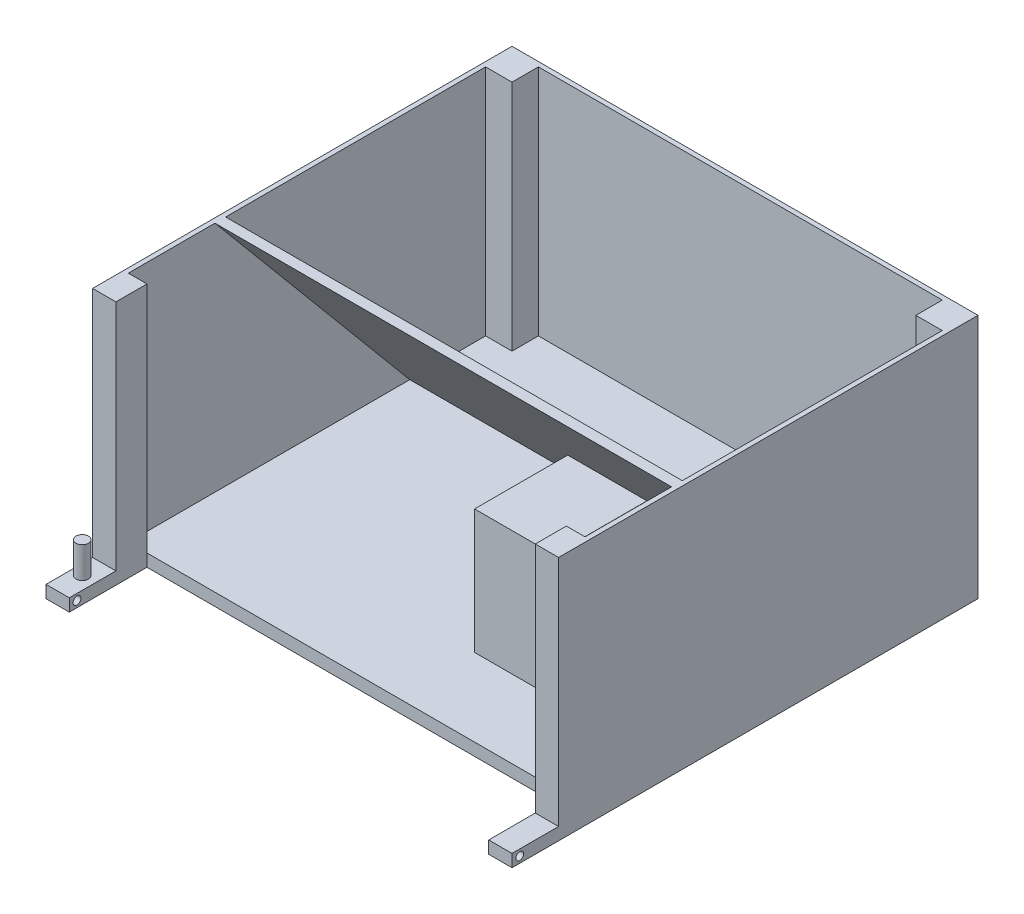
ISO-10303-21;
HEADER;
FILE_DESCRIPTION(('STEP AP214'),'2;1');
FILE_NAME('part.step','',(''),(''),'','','');
FILE_SCHEMA(('AUTOMOTIVE_DESIGN { 1 0 10303 214 1 1 1 1 }'));
ENDSEC;
DATA;
#1=APPLICATION_CONTEXT('core data for automotive mechanical design processes');
#2=APPLICATION_PROTOCOL_DEFINITION('international standard','automotive_design',2000,#1);
#3=PRODUCT_CONTEXT('',#1,'mechanical');
#4=PRODUCT('Part','Part','',(#3));
#5=PRODUCT_RELATED_PRODUCT_CATEGORY('part','',(#4));
#6=PRODUCT_DEFINITION_FORMATION('','',#4);
#7=PRODUCT_DEFINITION_CONTEXT('part definition',#1,'design');
#8=PRODUCT_DEFINITION('design','',#6,#7);
#9=PRODUCT_DEFINITION_SHAPE('','',#8);
#10=(LENGTH_UNIT() NAMED_UNIT(*) SI_UNIT(.MILLI.,.METRE.));
#11=(NAMED_UNIT(*) PLANE_ANGLE_UNIT() SI_UNIT($,.RADIAN.));
#12=(NAMED_UNIT(*) SI_UNIT($,.STERADIAN.) SOLID_ANGLE_UNIT());
#13=UNCERTAINTY_MEASURE_WITH_UNIT(LENGTH_MEASURE(1.E-05),#10,'distance_accuracy_value','');
#14=(GEOMETRIC_REPRESENTATION_CONTEXT(3) GLOBAL_UNCERTAINTY_ASSIGNED_CONTEXT((#13)) GLOBAL_UNIT_ASSIGNED_CONTEXT((#10,
#11,#12)) REPRESENTATION_CONTEXT('',''));
#15=CARTESIAN_POINT('',(0.,0.,0.));
#16=DIRECTION('',(0.,0.,1.));
#17=DIRECTION('',(1.,0.,0.));
#18=AXIS2_PLACEMENT_3D('',#15,#16,#17);
#19=CARTESIAN_POINT('',(0.,8.,0.));
#20=DIRECTION('',(0.,1.,0.));
#21=DIRECTION('',(0.,0.,1.));
#22=AXIS2_PLACEMENT_3D('',#19,#20,#21);
#23=PLANE('',#22);
#24=DIRECTION('',(1.,0.,0.));
#25=VECTOR('',#24,1.);
#26=CARTESIAN_POINT('',(0.,8.,-81.2002498096229));
#27=LINE('',#26,#25);
#28=CARTESIAN_POINT('',(-147.,8.,-81.2002498096229));
#29=VERTEX_POINT('',#28);
#30=CARTESIAN_POINT('',(147.,7.99999999999999,-81.2002498096229));
#31=VERTEX_POINT('',#30);
#32=EDGE_CURVE('E240',#29,#31,#27,.T.);
#33=ORIENTED_EDGE('',*,*,#32,.F.);
#34=DIRECTION('',(0.,0.,-1.));
#35=VECTOR('',#34,1.);
#36=CARTESIAN_POINT('',(-147.,8.,-147.));
#37=LINE('',#36,#35);
#38=CARTESIAN_POINT('',(-147.,8.,100.));
#39=VERTEX_POINT('',#38);
#40=EDGE_CURVE('E273',#39,#29,#37,.T.);
#41=ORIENTED_EDGE('',*,*,#40,.F.);
#42=DIRECTION('',(-1.,0.,0.));
#43=VECTOR('',#42,1.);
#44=CARTESIAN_POINT('',(-150.,8.,100.));
#45=LINE('',#44,#43);
#46=CARTESIAN_POINT('',(-135.,8.,100.));
#47=VERTEX_POINT('',#46);
#48=EDGE_CURVE('E295',#47,#39,#45,.T.);
#49=ORIENTED_EDGE('',*,*,#48,.F.);
#50=DIRECTION('',(1.,0.,0.));
#51=VECTOR('',#50,1.);
#52=CARTESIAN_POINT('',(-135.,8.,100.));
#53=LINE('',#52,#51);
#54=CARTESIAN_POINT('',(135.,8.,100.));
#55=VERTEX_POINT('',#54);
#56=EDGE_CURVE('E386',#47,#55,#53,.T.);
#57=ORIENTED_EDGE('',*,*,#56,.T.);
#58=DIRECTION('',(-1.,0.,0.));
#59=VECTOR('',#58,1.);
#60=CARTESIAN_POINT('',(150.,8.,100.));
#61=LINE('',#60,#59);
#62=CARTESIAN_POINT('',(147.,8.,100.));
#63=VERTEX_POINT('',#62);
#64=EDGE_CURVE('E313',#63,#55,#61,.T.);
#65=ORIENTED_EDGE('',*,*,#64,.F.);
#66=DIRECTION('',(0.,0.,1.));
#67=VECTOR('',#66,1.);
#68=CARTESIAN_POINT('',(147.,8.,-147.));
#69=LINE('',#68,#67);
#70=EDGE_CURVE('E263',#31,#63,#69,.T.);
#71=ORIENTED_EDGE('',*,*,#70,.F.);
#72=EDGE_LOOP('',(#33,#41,#49,#57,#65,#71));
#73=FACE_BOUND('',#72,.T.);
#74=DIRECTION('',(1.,0.,0.));
#75=VECTOR('',#74,1.);
#76=CARTESIAN_POINT('',(25.8889273202823,8.,50.));
#77=LINE('',#76,#75);
#78=CARTESIAN_POINT('',(25.8889273202823,8.,50.));
#79=VERTEX_POINT('',#78);
#80=CARTESIAN_POINT('',(76.8889273202823,8.,50.));
#81=VERTEX_POINT('',#80);
#82=EDGE_CURVE('E467',#79,#81,#77,.T.);
#83=ORIENTED_EDGE('',*,*,#82,.F.);
#84=DIRECTION('',(0.,0.,1.));
#85=VECTOR('',#84,1.);
#86=CARTESIAN_POINT('',(25.8889273202823,8.,-9.99999999999998));
#87=LINE('',#86,#85);
#88=CARTESIAN_POINT('',(25.8889273202823,8.,-9.99999999999998));
#89=VERTEX_POINT('',#88);
#90=EDGE_CURVE('E453',#89,#79,#87,.T.);
#91=ORIENTED_EDGE('',*,*,#90,.F.);
#92=DIRECTION('',(-1.,0.,0.));
#93=VECTOR('',#92,1.);
#94=CARTESIAN_POINT('',(25.8889273202823,8.,-9.99999999999998));
#95=LINE('',#94,#93);
#96=CARTESIAN_POINT('',(76.8889273202823,8.,-9.99999999999998));
#97=VERTEX_POINT('',#96);
#98=EDGE_CURVE('E458',#97,#89,#95,.T.);
#99=ORIENTED_EDGE('',*,*,#98,.F.);
#100=DIRECTION('',(0.,0.,-1.));
#101=VECTOR('',#100,1.);
#102=CARTESIAN_POINT('',(76.8889273202823,8.,-9.99999999999998));
#103=LINE('',#102,#101);
#104=EDGE_CURVE('E469',#81,#97,#103,.T.);
#105=ORIENTED_EDGE('',*,*,#104,.F.);
#106=EDGE_LOOP('',(#83,#91,#99,#105));
#107=FACE_BOUND('',#106,.T.);
#108=ADVANCED_FACE('F43',(#73,#107),#23,.T.);
#109=CARTESIAN_POINT('',(-147.,158.,-147.));
#110=DIRECTION('',(-1.,0.,0.));
#111=DIRECTION('',(0.,0.,1.));
#112=AXIS2_PLACEMENT_3D('',#109,#110,#111);
#113=PLANE('',#112);
#114=ORIENTED_EDGE('',*,*,#40,.T.);
#115=DIRECTION('',(0.,0.767076250368895,0.641555941535886));
#116=VECTOR('',#115,1.);
#117=CARTESIAN_POINT('',(-147.,63.8793699657748,-34.4646850028852));
#118=LINE('',#117,#116);
#119=CARTESIAN_POINT('',(-147.,158.,44.2545419194956));
#120=VERTEX_POINT('',#119);
#121=EDGE_CURVE('E447',#29,#120,#118,.T.);
#122=ORIENTED_EDGE('',*,*,#121,.T.);
#123=DIRECTION('',(0.,0.,-1.));
#124=VECTOR('',#123,1.);
#125=CARTESIAN_POINT('',(-147.,158.,-147.));
#126=LINE('',#125,#124);
#127=CARTESIAN_POINT('',(-147.,158.,100.));
#128=VERTEX_POINT('',#127);
#129=EDGE_CURVE('E257',#128,#120,#126,.T.);
#130=ORIENTED_EDGE('',*,*,#129,.F.);
#131=DIRECTION('',(0.,-1.,0.));
#132=VECTOR('',#131,1.);
#133=CARTESIAN_POINT('',(-147.,158.,100.));
#134=LINE('',#133,#132);
#135=EDGE_CURVE('E272',#128,#39,#134,.T.);
#136=ORIENTED_EDGE('',*,*,#135,.T.);
#137=EDGE_LOOP('',(#114,#122,#130,#136));
#138=FACE_BOUND('',#137,.T.);
#139=ADVANCED_FACE('F514',(#138),#113,.F.);
#140=CARTESIAN_POINT('',(147.,158.,-147.));
#141=DIRECTION('',(1.,0.,0.));
#142=DIRECTION('',(0.,0.,-1.));
#143=AXIS2_PLACEMENT_3D('',#140,#141,#142);
#144=PLANE('',#143);
#145=DIRECTION('',(0.,0.,1.));
#146=VECTOR('',#145,1.);
#147=CARTESIAN_POINT('',(147.,158.,-147.));
#148=LINE('',#147,#146);
#149=CARTESIAN_POINT('',(147.,158.,44.2545419194956));
#150=VERTEX_POINT('',#149);
#151=CARTESIAN_POINT('',(147.,158.,100.));
#152=VERTEX_POINT('',#151);
#153=EDGE_CURVE('E270',#150,#152,#148,.T.);
#154=ORIENTED_EDGE('',*,*,#153,.F.);
#155=DIRECTION('',(0.,-0.767076250368895,-0.641555941535886));
#156=VECTOR('',#155,1.);
#157=CARTESIAN_POINT('',(147.,63.8793699657748,-34.4646850028853));
#158=LINE('',#157,#156);
#159=EDGE_CURVE('E11',#150,#31,#158,.T.);
#160=ORIENTED_EDGE('',*,*,#159,.T.);
#161=ORIENTED_EDGE('',*,*,#70,.T.);
#162=DIRECTION('',(0.,1.,0.));
#163=VECTOR('',#162,1.);
#164=CARTESIAN_POINT('',(147.,158.,100.));
#165=LINE('',#164,#163);
#166=EDGE_CURVE('E281',#63,#152,#165,.T.);
#167=ORIENTED_EDGE('',*,*,#166,.T.);
#168=EDGE_LOOP('',(#154,#160,#161,#167));
#169=FACE_BOUND('',#168,.T.);
#170=ADVANCED_FACE('F521',(#169),#144,.F.);
#171=DIRECTION('',(-1.,0.,0.));
#172=VECTOR('',#171,1.);
#173=CARTESIAN_POINT('',(0.,8.,-88.0872446332747));
#174=LINE('',#173,#172);
#175=CARTESIAN_POINT('',(147.,7.99999999999999,-88.0872446332748));
#176=VERTEX_POINT('',#175);
#177=CARTESIAN_POINT('',(-147.,8.,-88.0872446332747));
#178=VERTEX_POINT('',#177);
#179=EDGE_CURVE('E236',#176,#178,#174,.T.);
#180=ORIENTED_EDGE('',*,*,#179,.F.);
#181=CARTESIAN_POINT('',(147.,8.,-130.));
#182=VERTEX_POINT('',#181);
#183=EDGE_CURVE('E258',#182,#176,#69,.T.);
#184=ORIENTED_EDGE('',*,*,#183,.F.);
#185=DIRECTION('',(1.,0.,0.));
#186=VECTOR('',#185,1.);
#187=CARTESIAN_POINT('',(150.,8.,-130.));
#188=LINE('',#187,#186);
#189=CARTESIAN_POINT('',(130.,8.,-130.));
#190=VERTEX_POINT('',#189);
#191=EDGE_CURVE('E338',#190,#182,#188,.T.);
#192=ORIENTED_EDGE('',*,*,#191,.F.);
#193=DIRECTION('',(0.,0.,1.));
#194=VECTOR('',#193,1.);
#195=CARTESIAN_POINT('',(130.,8.,-150.));
#196=LINE('',#195,#194);
#197=CARTESIAN_POINT('',(130.,8.,-147.));
#198=VERTEX_POINT('',#197);
#199=EDGE_CURVE('E334',#198,#190,#196,.T.);
#200=ORIENTED_EDGE('',*,*,#199,.F.);
#201=DIRECTION('',(1.,0.,0.));
#202=VECTOR('',#201,1.);
#203=CARTESIAN_POINT('',(-147.,8.,-147.));
#204=LINE('',#203,#202);
#205=CARTESIAN_POINT('',(-130.,8.,-147.));
#206=VERTEX_POINT('',#205);
#207=EDGE_CURVE('E276',#206,#198,#204,.T.);
#208=ORIENTED_EDGE('',*,*,#207,.F.);
#209=DIRECTION('',(0.,0.,-1.));
#210=VECTOR('',#209,1.);
#211=CARTESIAN_POINT('',(-130.,8.,-150.));
#212=LINE('',#211,#210);
#213=CARTESIAN_POINT('',(-130.,8.,-130.));
#214=VERTEX_POINT('',#213);
#215=EDGE_CURVE('E352',#214,#206,#212,.T.);
#216=ORIENTED_EDGE('',*,*,#215,.F.);
#217=DIRECTION('',(1.,0.,0.));
#218=VECTOR('',#217,1.);
#219=CARTESIAN_POINT('',(-150.,8.,-130.));
#220=LINE('',#219,#218);
#221=CARTESIAN_POINT('',(-147.,8.,-130.));
#222=VERTEX_POINT('',#221);
#223=EDGE_CURVE('E348',#222,#214,#220,.T.);
#224=ORIENTED_EDGE('',*,*,#223,.F.);
#225=EDGE_CURVE('E277',#178,#222,#37,.T.);
#226=ORIENTED_EDGE('',*,*,#225,.F.);
#227=EDGE_LOOP('',(#180,#184,#192,#200,#208,#216,#224,#226));
#228=FACE_BOUND('',#227,.T.);
#229=ADVANCED_FACE('F440',(#228),#23,.T.);
#230=CARTESIAN_POINT('',(-150.,158.,-130.));
#231=DIRECTION('',(0.,0.,-1.));
#232=DIRECTION('',(-1.,0.,0.));
#233=AXIS2_PLACEMENT_3D('',#230,#231,#232);
#234=PLANE('',#233);
#235=DIRECTION('',(0.,1.,0.));
#236=VECTOR('',#235,1.);
#237=CARTESIAN_POINT('',(-147.,158.,-130.));
#238=LINE('',#237,#236);
#239=CARTESIAN_POINT('',(-147.,158.,-130.));
#240=VERTEX_POINT('',#239);
#241=EDGE_CURVE('E255',#222,#240,#238,.T.);
#242=ORIENTED_EDGE('',*,*,#241,.F.);
#243=ORIENTED_EDGE('',*,*,#223,.T.);
#244=DIRECTION('',(0.,-1.,0.));
#245=VECTOR('',#244,1.);
#246=CARTESIAN_POINT('',(-130.,158.,-130.));
#247=LINE('',#246,#245);
#248=CARTESIAN_POINT('',(-130.,158.,-130.));
#249=VERTEX_POINT('',#248);
#250=EDGE_CURVE('E360',#249,#214,#247,.T.);
#251=ORIENTED_EDGE('',*,*,#250,.F.);
#252=DIRECTION('',(1.,0.,0.));
#253=VECTOR('',#252,1.);
#254=CARTESIAN_POINT('',(-150.,158.,-130.));
#255=LINE('',#254,#253);
#256=EDGE_CURVE('E351',#240,#249,#255,.T.);
#257=ORIENTED_EDGE('',*,*,#256,.F.);
#258=EDGE_LOOP('',(#242,#243,#251,#257));
#259=FACE_BOUND('',#258,.T.);
#260=ADVANCED_FACE('F483',(#259),#234,.F.);
#261=CARTESIAN_POINT('',(-130.,158.,-150.));
#262=DIRECTION('',(-1.,0.,0.));
#263=DIRECTION('',(0.,0.,1.));
#264=AXIS2_PLACEMENT_3D('',#261,#262,#263);
#265=PLANE('',#264);
#266=DIRECTION('',(0.,-1.,0.));
#267=VECTOR('',#266,1.);
#268=CARTESIAN_POINT('',(-130.,158.,-147.));
#269=LINE('',#268,#267);
#270=CARTESIAN_POINT('',(-130.,158.,-147.));
#271=VERTEX_POINT('',#270);
#272=EDGE_CURVE('E289',#271,#206,#269,.T.);
#273=ORIENTED_EDGE('',*,*,#272,.F.);
#274=DIRECTION('',(0.,0.,-1.));
#275=VECTOR('',#274,1.);
#276=CARTESIAN_POINT('',(-130.,158.,-150.));
#277=LINE('',#276,#275);
#278=EDGE_CURVE('E354',#249,#271,#277,.T.);
#279=ORIENTED_EDGE('',*,*,#278,.F.);
#280=ORIENTED_EDGE('',*,*,#250,.T.);
#281=ORIENTED_EDGE('',*,*,#215,.T.);
#282=EDGE_LOOP('',(#273,#279,#280,#281));
#283=FACE_BOUND('',#282,.T.);
#284=ADVANCED_FACE('F491',(#283),#265,.F.);
#285=CARTESIAN_POINT('',(130.,158.,-150.));
#286=DIRECTION('',(1.,0.,0.));
#287=DIRECTION('',(0.,0.,-1.));
#288=AXIS2_PLACEMENT_3D('',#285,#286,#287);
#289=PLANE('',#288);
#290=DIRECTION('',(0.,1.,0.));
#291=VECTOR('',#290,1.);
#292=CARTESIAN_POINT('',(130.,158.,-147.));
#293=LINE('',#292,#291);
#294=CARTESIAN_POINT('',(130.,158.,-147.));
#295=VERTEX_POINT('',#294);
#296=EDGE_CURVE('E286',#198,#295,#293,.T.);
#297=ORIENTED_EDGE('',*,*,#296,.F.);
#298=ORIENTED_EDGE('',*,*,#199,.T.);
#299=DIRECTION('',(0.,-1.,0.));
#300=VECTOR('',#299,1.);
#301=CARTESIAN_POINT('',(130.,158.,-130.));
#302=LINE('',#301,#300);
#303=CARTESIAN_POINT('',(130.,158.,-130.));
#304=VERTEX_POINT('',#303);
#305=EDGE_CURVE('E342',#304,#190,#302,.T.);
#306=ORIENTED_EDGE('',*,*,#305,.F.);
#307=DIRECTION('',(0.,0.,1.));
#308=VECTOR('',#307,1.);
#309=CARTESIAN_POINT('',(130.,158.,-150.));
#310=LINE('',#309,#308);
#311=EDGE_CURVE('E335',#295,#304,#310,.T.);
#312=ORIENTED_EDGE('',*,*,#311,.F.);
#313=EDGE_LOOP('',(#297,#298,#306,#312));
#314=FACE_BOUND('',#313,.T.);
#315=ADVANCED_FACE('F498',(#314),#289,.F.);
#316=CARTESIAN_POINT('',(150.,158.,-130.));
#317=DIRECTION('',(0.,0.,-1.));
#318=DIRECTION('',(-1.,0.,0.));
#319=AXIS2_PLACEMENT_3D('',#316,#317,#318);
#320=PLANE('',#319);
#321=DIRECTION('',(0.,-1.,0.));
#322=VECTOR('',#321,1.);
#323=CARTESIAN_POINT('',(147.,158.,-130.));
#324=LINE('',#323,#322);
#325=CARTESIAN_POINT('',(147.,158.,-130.));
#326=VERTEX_POINT('',#325);
#327=EDGE_CURVE('E284',#326,#182,#324,.T.);
#328=ORIENTED_EDGE('',*,*,#327,.F.);
#329=DIRECTION('',(1.,0.,0.));
#330=VECTOR('',#329,1.);
#331=CARTESIAN_POINT('',(150.,158.,-130.));
#332=LINE('',#331,#330);
#333=EDGE_CURVE('E337',#304,#326,#332,.T.);
#334=ORIENTED_EDGE('',*,*,#333,.F.);
#335=ORIENTED_EDGE('',*,*,#305,.T.);
#336=ORIENTED_EDGE('',*,*,#191,.T.);
#337=EDGE_LOOP('',(#328,#334,#335,#336));
#338=FACE_BOUND('',#337,.T.);
#339=ADVANCED_FACE('F501',(#338),#320,.F.);
#340=CARTESIAN_POINT('',(150.,158.,100.));
#341=DIRECTION('',(0.,0.,1.));
#342=DIRECTION('',(1.,0.,0.));
#343=AXIS2_PLACEMENT_3D('',#340,#341,#342);
#344=PLANE('',#343);
#345=ORIENTED_EDGE('',*,*,#166,.F.);
#346=ORIENTED_EDGE('',*,*,#64,.T.);
#347=DIRECTION('',(0.,-1.,0.));
#348=VECTOR('',#347,1.);
#349=CARTESIAN_POINT('',(135.,158.,100.));
#350=LINE('',#349,#348);
#351=CARTESIAN_POINT('',(135.,158.,100.));
#352=VERTEX_POINT('',#351);
#353=EDGE_CURVE('E331',#352,#55,#350,.T.);
#354=ORIENTED_EDGE('',*,*,#353,.F.);
#355=DIRECTION('',(-1.,0.,0.));
#356=VECTOR('',#355,1.);
#357=CARTESIAN_POINT('',(150.,158.,100.));
#358=LINE('',#357,#356);
#359=EDGE_CURVE('E314',#152,#352,#358,.T.);
#360=ORIENTED_EDGE('',*,*,#359,.F.);
#361=EDGE_LOOP('',(#345,#346,#354,#360));
#362=FACE_BOUND('',#361,.T.);
#363=ADVANCED_FACE('F503',(#362),#344,.F.);
#364=CARTESIAN_POINT('',(-150.,158.,100.));
#365=DIRECTION('',(0.,0.,1.));
#366=DIRECTION('',(1.,0.,0.));
#367=AXIS2_PLACEMENT_3D('',#364,#365,#366);
#368=PLANE('',#367);
#369=ORIENTED_EDGE('',*,*,#135,.F.);
#370=DIRECTION('',(-1.,0.,0.));
#371=VECTOR('',#370,1.);
#372=CARTESIAN_POINT('',(-150.,158.,100.));
#373=LINE('',#372,#371);
#374=CARTESIAN_POINT('',(-135.,158.,100.));
#375=VERTEX_POINT('',#374);
#376=EDGE_CURVE('E297',#375,#128,#373,.T.);
#377=ORIENTED_EDGE('',*,*,#376,.F.);
#378=DIRECTION('',(0.,-1.,0.));
#379=VECTOR('',#378,1.);
#380=CARTESIAN_POINT('',(-135.,158.,100.));
#381=LINE('',#380,#379);
#382=EDGE_CURVE('E300',#375,#47,#381,.T.);
#383=ORIENTED_EDGE('',*,*,#382,.T.);
#384=ORIENTED_EDGE('',*,*,#48,.T.);
#385=EDGE_LOOP('',(#369,#377,#383,#384));
#386=FACE_BOUND('',#385,.T.);
#387=ADVANCED_FACE('F509',(#386),#368,.F.);
#388=CARTESIAN_POINT('',(-143.273126196128,8.,133.426649837952));
#389=DIRECTION('',(0.,1.,0.));
#390=DIRECTION('',(0.,0.,1.));
#391=AXIS2_PLACEMENT_3D('',#388,#389,#390);
#392=CIRCLE('',#391,3.99999999999999);
#393=CARTESIAN_POINT('',(-143.273126196128,8.,137.426649837952));
#394=VERTEX_POINT('',#393);
#395=EDGE_CURVE('E542',#394,#394,#392,.T.);
#396=ORIENTED_EDGE('',*,*,#395,.F.);
#397=EDGE_LOOP('',(#396));
#398=FACE_BOUND('',#397,.T.);
#399=DIRECTION('',(0.,0.,-1.));
#400=VECTOR('',#399,1.);
#401=CARTESIAN_POINT('',(-135.,8.,100.));
#402=LINE('',#401,#400);
#403=CARTESIAN_POINT('',(-135.,8.,150.));
#404=VERTEX_POINT('',#403);
#405=CARTESIAN_POINT('',(-135.,8.,120.));
#406=VERTEX_POINT('',#405);
#407=EDGE_CURVE('E384',#404,#406,#402,.T.);
#408=ORIENTED_EDGE('',*,*,#407,.T.);
#409=DIRECTION('',(1.,0.,0.));
#410=VECTOR('',#409,1.);
#411=CARTESIAN_POINT('',(-150.,8.,120.));
#412=LINE('',#411,#410);
#413=CARTESIAN_POINT('',(-150.,8.,120.));
#414=VERTEX_POINT('',#413);
#415=EDGE_CURVE('E291',#414,#406,#412,.T.);
#416=ORIENTED_EDGE('',*,*,#415,.F.);
#417=DIRECTION('',(0.,0.,1.));
#418=VECTOR('',#417,1.);
#419=CARTESIAN_POINT('',(-150.,8.,-150.));
#420=LINE('',#419,#418);
#421=CARTESIAN_POINT('',(-150.,8.,150.));
#422=VERTEX_POINT('',#421);
#423=EDGE_CURVE('E379',#414,#422,#420,.T.);
#424=ORIENTED_EDGE('',*,*,#423,.T.);
#425=DIRECTION('',(1.,0.,0.));
#426=VECTOR('',#425,1.);
#427=CARTESIAN_POINT('',(-150.,8.,150.));
#428=LINE('',#427,#426);
#429=EDGE_CURVE('E382',#422,#404,#428,.T.);
#430=ORIENTED_EDGE('',*,*,#429,.T.);
#431=EDGE_LOOP('',(#408,#416,#424,#430));
#432=FACE_BOUND('',#431,.T.);
#433=ADVANCED_FACE('F517',(#398,#432),#23,.T.);
#434=DIRECTION('',(0.,0.,-1.));
#435=VECTOR('',#434,1.);
#436=CARTESIAN_POINT('',(150.,8.,-150.));
#437=LINE('',#436,#435);
#438=CARTESIAN_POINT('',(150.,8.,150.));
#439=VERTEX_POINT('',#438);
#440=CARTESIAN_POINT('',(150.,8.,120.));
#441=VERTEX_POINT('',#440);
#442=EDGE_CURVE('E377',#439,#441,#437,.T.);
#443=ORIENTED_EDGE('',*,*,#442,.T.);
#444=DIRECTION('',(1.,0.,0.));
#445=VECTOR('',#444,1.);
#446=CARTESIAN_POINT('',(150.,8.,120.));
#447=LINE('',#446,#445);
#448=CARTESIAN_POINT('',(135.,8.,120.));
#449=VERTEX_POINT('',#448);
#450=EDGE_CURVE('E317',#449,#441,#447,.T.);
#451=ORIENTED_EDGE('',*,*,#450,.F.);
#452=DIRECTION('',(0.,0.,1.));
#453=VECTOR('',#452,1.);
#454=CARTESIAN_POINT('',(135.,8.,100.));
#455=LINE('',#454,#453);
#456=CARTESIAN_POINT('',(135.,8.,150.));
#457=VERTEX_POINT('',#456);
#458=EDGE_CURVE('E389',#449,#457,#455,.T.);
#459=ORIENTED_EDGE('',*,*,#458,.T.);
#460=DIRECTION('',(1.,0.,0.));
#461=VECTOR('',#460,1.);
#462=CARTESIAN_POINT('',(135.,8.,150.));
#463=LINE('',#462,#461);
#464=EDGE_CURVE('E391',#457,#439,#463,.T.);
#465=ORIENTED_EDGE('',*,*,#464,.T.);
#466=EDGE_LOOP('',(#443,#451,#459,#465));
#467=FACE_BOUND('',#466,.T.);
#468=ADVANCED_FACE('F529',(#467),#23,.T.);
#469=CARTESIAN_POINT('',(150.,8.,-150.));
#470=DIRECTION('',(-1.,0.,0.));
#471=DIRECTION('',(0.,0.,1.));
#472=AXIS2_PLACEMENT_3D('',#469,#470,#471);
#473=PLANE('',#472);
#474=DIRECTION('',(0.,-1.,0.));
#475=VECTOR('',#474,1.);
#476=CARTESIAN_POINT('',(150.,8.,-150.));
#477=LINE('',#476,#475);
#478=CARTESIAN_POINT('',(150.,158.,-150.));
#479=VERTEX_POINT('',#478);
#480=CARTESIAN_POINT('',(150.,0.,-150.));
#481=VERTEX_POINT('',#480);
#482=EDGE_CURVE('E428',#479,#481,#477,.T.);
#483=ORIENTED_EDGE('',*,*,#482,.F.);
#484=DIRECTION('',(0.,0.,-1.));
#485=VECTOR('',#484,1.);
#486=CARTESIAN_POINT('',(150.,158.,-150.));
#487=LINE('',#486,#485);
#488=CARTESIAN_POINT('',(150.,158.,120.));
#489=VERTEX_POINT('',#488);
#490=EDGE_CURVE('E340',#489,#479,#487,.T.);
#491=ORIENTED_EDGE('',*,*,#490,.F.);
#492=DIRECTION('',(0.,-1.,0.));
#493=VECTOR('',#492,1.);
#494=CARTESIAN_POINT('',(150.,158.,120.));
#495=LINE('',#494,#493);
#496=EDGE_CURVE('E322',#489,#441,#495,.T.);
#497=ORIENTED_EDGE('',*,*,#496,.T.);
#498=ORIENTED_EDGE('',*,*,#442,.F.);
#499=DIRECTION('',(0.,-1.,0.));
#500=VECTOR('',#499,1.);
#501=CARTESIAN_POINT('',(150.,8.,150.));
#502=LINE('',#501,#500);
#503=CARTESIAN_POINT('',(150.,0.,150.));
#504=VERTEX_POINT('',#503);
#505=EDGE_CURVE('E393',#439,#504,#502,.T.);
#506=ORIENTED_EDGE('',*,*,#505,.T.);
#507=DIRECTION('',(0.,0.,-1.));
#508=VECTOR('',#507,1.);
#509=CARTESIAN_POINT('',(150.,0.,-150.));
#510=LINE('',#509,#508);
#511=EDGE_CURVE('E376',#504,#481,#510,.T.);
#512=ORIENTED_EDGE('',*,*,#511,.T.);
#513=EDGE_LOOP('',(#483,#491,#497,#498,#506,#512));
#514=FACE_BOUND('',#513,.T.);
#515=CARTESIAN_POINT('',(150.,4.,145.033528282622));
#516=DIRECTION('',(1.,0.,0.));
#517=DIRECTION('',(0.,0.,-1.));
#518=AXIS2_PLACEMENT_3D('',#515,#516,#517);
#519=CIRCLE('',#518,2.5);
#520=CARTESIAN_POINT('',(150.,4.,142.533528282622));
#521=VERTEX_POINT('',#520);
#522=EDGE_CURVE('E366',#521,#521,#519,.T.);
#523=ORIENTED_EDGE('',*,*,#522,.F.);
#524=EDGE_LOOP('',(#523));
#525=FACE_BOUND('',#524,.T.);
#526=ADVANCED_FACE('F45',(#514,#525),#473,.F.);
#527=CARTESIAN_POINT('',(-150.,8.,-150.));
#528=DIRECTION('',(0.,0.,1.));
#529=DIRECTION('',(1.,0.,0.));
#530=AXIS2_PLACEMENT_3D('',#527,#528,#529);
#531=PLANE('',#530);
#532=DIRECTION('',(-1.,0.,0.));
#533=VECTOR('',#532,1.);
#534=CARTESIAN_POINT('',(-150.,158.,-150.));
#535=LINE('',#534,#533);
#536=CARTESIAN_POINT('',(-150.,158.,-150.));
#537=VERTEX_POINT('',#536);
#538=EDGE_CURVE('E357',#479,#537,#535,.T.);
#539=ORIENTED_EDGE('',*,*,#538,.F.);
#540=ORIENTED_EDGE('',*,*,#482,.T.);
#541=DIRECTION('',(-1.,0.,0.));
#542=VECTOR('',#541,1.);
#543=CARTESIAN_POINT('',(-150.,0.,-150.));
#544=LINE('',#543,#542);
#545=CARTESIAN_POINT('',(-150.,0.,-150.));
#546=VERTEX_POINT('',#545);
#547=EDGE_CURVE('E395',#481,#546,#544,.T.);
#548=ORIENTED_EDGE('',*,*,#547,.T.);
#549=DIRECTION('',(0.,-1.,0.));
#550=VECTOR('',#549,1.);
#551=CARTESIAN_POINT('',(-150.,8.,-150.));
#552=LINE('',#551,#550);
#553=EDGE_CURVE('E426',#537,#546,#552,.T.);
#554=ORIENTED_EDGE('',*,*,#553,.F.);
#555=EDGE_LOOP('',(#539,#540,#548,#554));
#556=FACE_BOUND('',#555,.T.);
#557=ADVANCED_FACE('F659',(#556),#531,.F.);
#558=CARTESIAN_POINT('',(-150.,8.,-150.));
#559=DIRECTION('',(1.,0.,0.));
#560=DIRECTION('',(0.,0.,-1.));
#561=AXIS2_PLACEMENT_3D('',#558,#559,#560);
#562=PLANE('',#561);
#563=DIRECTION('',(0.,0.,1.));
#564=VECTOR('',#563,1.);
#565=CARTESIAN_POINT('',(-150.,0.,-150.));
#566=LINE('',#565,#564);
#567=CARTESIAN_POINT('',(-150.,0.,150.));
#568=VERTEX_POINT('',#567);
#569=EDGE_CURVE('E398',#546,#568,#566,.T.);
#570=ORIENTED_EDGE('',*,*,#569,.T.);
#571=DIRECTION('',(0.,-1.,0.));
#572=VECTOR('',#571,1.);
#573=CARTESIAN_POINT('',(-150.,8.,150.));
#574=LINE('',#573,#572);
#575=EDGE_CURVE('E423',#422,#568,#574,.T.);
#576=ORIENTED_EDGE('',*,*,#575,.F.);
#577=ORIENTED_EDGE('',*,*,#423,.F.);
#578=DIRECTION('',(0.,-1.,0.));
#579=VECTOR('',#578,1.);
#580=CARTESIAN_POINT('',(-150.,158.,120.));
#581=LINE('',#580,#579);
#582=CARTESIAN_POINT('',(-150.,158.,120.));
#583=VERTEX_POINT('',#582);
#584=EDGE_CURVE('E310',#583,#414,#581,.T.);
#585=ORIENTED_EDGE('',*,*,#584,.F.);
#586=DIRECTION('',(0.,0.,1.));
#587=VECTOR('',#586,1.);
#588=CARTESIAN_POINT('',(-150.,158.,-150.));
#589=LINE('',#588,#587);
#590=EDGE_CURVE('E349',#537,#583,#589,.T.);
#591=ORIENTED_EDGE('',*,*,#590,.F.);
#592=ORIENTED_EDGE('',*,*,#553,.T.);
#593=EDGE_LOOP('',(#570,#576,#577,#585,#591,#592));
#594=FACE_BOUND('',#593,.T.);
#595=CARTESIAN_POINT('',(-150.,4.,145.033528282622));
#596=DIRECTION('',(1.,0.,0.));
#597=DIRECTION('',(0.,0.,-1.));
#598=AXIS2_PLACEMENT_3D('',#595,#596,#597);
#599=CIRCLE('',#598,2.5);
#600=CARTESIAN_POINT('',(-150.,4.,142.533528282622));
#601=VERTEX_POINT('',#600);
#602=EDGE_CURVE('E369',#601,#601,#599,.T.);
#603=ORIENTED_EDGE('',*,*,#602,.T.);
#604=EDGE_LOOP('',(#603));
#605=FACE_BOUND('',#604,.T.);
#606=ADVANCED_FACE('F560',(#594,#605),#562,.F.);
#607=CARTESIAN_POINT('',(-150.,8.,150.));
#608=DIRECTION('',(0.,0.,-1.));
#609=DIRECTION('',(-1.,0.,0.));
#610=AXIS2_PLACEMENT_3D('',#607,#608,#609);
#611=PLANE('',#610);
#612=DIRECTION('',(1.,0.,0.));
#613=VECTOR('',#612,1.);
#614=CARTESIAN_POINT('',(-150.,0.,150.));
#615=LINE('',#614,#613);
#616=CARTESIAN_POINT('',(-135.,0.,150.));
#617=VERTEX_POINT('',#616);
#618=EDGE_CURVE('E400',#568,#617,#615,.T.);
#619=ORIENTED_EDGE('',*,*,#618,.T.);
#620=DIRECTION('',(0.,-1.,0.));
#621=VECTOR('',#620,1.);
#622=CARTESIAN_POINT('',(-135.,8.,150.));
#623=LINE('',#622,#621);
#624=EDGE_CURVE('E420',#404,#617,#623,.T.);
#625=ORIENTED_EDGE('',*,*,#624,.F.);
#626=ORIENTED_EDGE('',*,*,#429,.F.);
#627=ORIENTED_EDGE('',*,*,#575,.T.);
#628=EDGE_LOOP('',(#619,#625,#626,#627));
#629=FACE_BOUND('',#628,.T.);
#630=ADVANCED_FACE('F566',(#629),#611,.F.);
#631=CARTESIAN_POINT('',(-135.,8.,100.));
#632=DIRECTION('',(-1.,0.,0.));
#633=DIRECTION('',(0.,0.,1.));
#634=AXIS2_PLACEMENT_3D('',#631,#632,#633);
#635=PLANE('',#634);
#636=CARTESIAN_POINT('',(-135.,4.,145.033528282622));
#637=DIRECTION('',(-1.,0.,0.));
#638=DIRECTION('',(0.,0.,1.));
#639=AXIS2_PLACEMENT_3D('',#636,#637,#638);
#640=CIRCLE('',#639,2.5);
#641=CARTESIAN_POINT('',(-135.,4.,147.533528282622));
#642=VERTEX_POINT('',#641);
#643=EDGE_CURVE('E373',#642,#642,#640,.T.);
#644=ORIENTED_EDGE('',*,*,#643,.T.);
#645=EDGE_LOOP('',(#644));
#646=FACE_BOUND('',#645,.T.);
#647=DIRECTION('',(0.,0.,-1.));
#648=VECTOR('',#647,1.);
#649=CARTESIAN_POINT('',(-135.,0.,100.));
#650=LINE('',#649,#648);
#651=CARTESIAN_POINT('',(-135.,0.,100.));
#652=VERTEX_POINT('',#651);
#653=EDGE_CURVE('E402',#617,#652,#650,.T.);
#654=ORIENTED_EDGE('',*,*,#653,.T.);
#655=DIRECTION('',(0.,-1.,0.));
#656=VECTOR('',#655,1.);
#657=CARTESIAN_POINT('',(-135.,8.,100.));
#658=LINE('',#657,#656);
#659=EDGE_CURVE('E417',#47,#652,#658,.T.);
#660=ORIENTED_EDGE('',*,*,#659,.F.);
#661=ORIENTED_EDGE('',*,*,#382,.F.);
#662=DIRECTION('',(0.,0.,-1.));
#663=VECTOR('',#662,1.);
#664=CARTESIAN_POINT('',(-135.,158.,100.));
#665=LINE('',#664,#663);
#666=CARTESIAN_POINT('',(-135.,158.,120.));
#667=VERTEX_POINT('',#666);
#668=EDGE_CURVE('E294',#667,#375,#665,.T.);
#669=ORIENTED_EDGE('',*,*,#668,.F.);
#670=DIRECTION('',(0.,-1.,0.));
#671=VECTOR('',#670,1.);
#672=CARTESIAN_POINT('',(-135.,158.,120.));
#673=LINE('',#672,#671);
#674=EDGE_CURVE('E307',#667,#406,#673,.T.);
#675=ORIENTED_EDGE('',*,*,#674,.T.);
#676=ORIENTED_EDGE('',*,*,#407,.F.);
#677=ORIENTED_EDGE('',*,*,#624,.T.);
#678=EDGE_LOOP('',(#654,#660,#661,#669,#675,#676,#677));
#679=FACE_BOUND('',#678,.T.);
#680=ADVANCED_FACE('F554',(#646,#679),#635,.F.);
#681=CARTESIAN_POINT('',(-135.,8.,100.));
#682=DIRECTION('',(0.,0.,-1.));
#683=DIRECTION('',(-1.,0.,0.));
#684=AXIS2_PLACEMENT_3D('',#681,#682,#683);
#685=PLANE('',#684);
#686=DIRECTION('',(1.,0.,0.));
#687=VECTOR('',#686,1.);
#688=CARTESIAN_POINT('',(-135.,0.,100.));
#689=LINE('',#688,#687);
#690=CARTESIAN_POINT('',(135.,0.,100.));
#691=VERTEX_POINT('',#690);
#692=EDGE_CURVE('E404',#652,#691,#689,.T.);
#693=ORIENTED_EDGE('',*,*,#692,.T.);
#694=DIRECTION('',(0.,-1.,0.));
#695=VECTOR('',#694,1.);
#696=CARTESIAN_POINT('',(135.,8.,100.));
#697=LINE('',#696,#695);
#698=EDGE_CURVE('E414',#55,#691,#697,.T.);
#699=ORIENTED_EDGE('',*,*,#698,.F.);
#700=ORIENTED_EDGE('',*,*,#56,.F.);
#701=ORIENTED_EDGE('',*,*,#659,.T.);
#702=EDGE_LOOP('',(#693,#699,#700,#701));
#703=FACE_BOUND('',#702,.T.);
#704=ADVANCED_FACE('F576',(#703),#685,.F.);
#705=CARTESIAN_POINT('',(135.,8.,100.));
#706=DIRECTION('',(1.,0.,0.));
#707=DIRECTION('',(0.,0.,-1.));
#708=AXIS2_PLACEMENT_3D('',#705,#706,#707);
#709=PLANE('',#708);
#710=CARTESIAN_POINT('',(135.,4.,145.033528282622));
#711=DIRECTION('',(1.,0.,0.));
#712=DIRECTION('',(0.,0.,-1.));
#713=AXIS2_PLACEMENT_3D('',#710,#711,#712);
#714=CIRCLE('',#713,2.5);
#715=CARTESIAN_POINT('',(135.,4.,142.533528282622));
#716=VERTEX_POINT('',#715);
#717=EDGE_CURVE('E372',#716,#716,#714,.T.);
#718=ORIENTED_EDGE('',*,*,#717,.T.);
#719=EDGE_LOOP('',(#718));
#720=FACE_BOUND('',#719,.T.);
#721=DIRECTION('',(0.,0.,1.));
#722=VECTOR('',#721,1.);
#723=CARTESIAN_POINT('',(135.,0.,100.));
#724=LINE('',#723,#722);
#725=CARTESIAN_POINT('',(135.,0.,150.));
#726=VERTEX_POINT('',#725);
#727=EDGE_CURVE('E406',#691,#726,#724,.T.);
#728=ORIENTED_EDGE('',*,*,#727,.T.);
#729=DIRECTION('',(0.,-1.,0.));
#730=VECTOR('',#729,1.);
#731=CARTESIAN_POINT('',(135.,8.,150.));
#732=LINE('',#731,#730);
#733=EDGE_CURVE('E411',#457,#726,#732,.T.);
#734=ORIENTED_EDGE('',*,*,#733,.F.);
#735=ORIENTED_EDGE('',*,*,#458,.F.);
#736=DIRECTION('',(0.,-1.,0.));
#737=VECTOR('',#736,1.);
#738=CARTESIAN_POINT('',(135.,158.,120.));
#739=LINE('',#738,#737);
#740=CARTESIAN_POINT('',(135.,158.,120.));
#741=VERTEX_POINT('',#740);
#742=EDGE_CURVE('E328',#741,#449,#739,.T.);
#743=ORIENTED_EDGE('',*,*,#742,.F.);
#744=DIRECTION('',(0.,0.,1.));
#745=VECTOR('',#744,1.);
#746=CARTESIAN_POINT('',(135.,158.,100.));
#747=LINE('',#746,#745);
#748=EDGE_CURVE('E316',#352,#741,#747,.T.);
#749=ORIENTED_EDGE('',*,*,#748,.F.);
#750=ORIENTED_EDGE('',*,*,#353,.T.);
#751=ORIENTED_EDGE('',*,*,#698,.T.);
#752=EDGE_LOOP('',(#728,#734,#735,#743,#749,#750,#751));
#753=FACE_BOUND('',#752,.T.);
#754=ADVANCED_FACE('F578',(#720,#753),#709,.F.);
#755=CARTESIAN_POINT('',(135.,8.,150.));
#756=DIRECTION('',(0.,0.,-1.));
#757=DIRECTION('',(-1.,0.,0.));
#758=AXIS2_PLACEMENT_3D('',#755,#756,#757);
#759=PLANE('',#758);
#760=DIRECTION('',(1.,0.,0.));
#761=VECTOR('',#760,1.);
#762=CARTESIAN_POINT('',(135.,0.,150.));
#763=LINE('',#762,#761);
#764=EDGE_CURVE('E380',#726,#504,#763,.T.);
#765=ORIENTED_EDGE('',*,*,#764,.T.);
#766=ORIENTED_EDGE('',*,*,#505,.F.);
#767=ORIENTED_EDGE('',*,*,#464,.F.);
#768=ORIENTED_EDGE('',*,*,#733,.T.);
#769=EDGE_LOOP('',(#765,#766,#767,#768));
#770=FACE_BOUND('',#769,.T.);
#771=ADVANCED_FACE('F656',(#770),#759,.F.);
#772=CARTESIAN_POINT('',(0.,0.,0.));
#773=DIRECTION('',(0.,1.,0.));
#774=DIRECTION('',(0.,0.,1.));
#775=AXIS2_PLACEMENT_3D('',#772,#773,#774);
#776=PLANE('',#775);
#777=ORIENTED_EDGE('',*,*,#547,.F.);
#778=ORIENTED_EDGE('',*,*,#511,.F.);
#779=ORIENTED_EDGE('',*,*,#764,.F.);
#780=ORIENTED_EDGE('',*,*,#727,.F.);
#781=ORIENTED_EDGE('',*,*,#692,.F.);
#782=ORIENTED_EDGE('',*,*,#653,.F.);
#783=ORIENTED_EDGE('',*,*,#618,.F.);
#784=ORIENTED_EDGE('',*,*,#569,.F.);
#785=EDGE_LOOP('',(#777,#778,#779,#780,#781,#782,#783,#784));
#786=FACE_BOUND('',#785,.T.);
#787=ADVANCED_FACE('F571',(#786),#776,.F.);
#788=CARTESIAN_POINT('',(-150.,4.,145.033528282622));
#789=DIRECTION('',(1.,0.,0.));
#790=DIRECTION('',(0.,0.,-1.));
#791=AXIS2_PLACEMENT_3D('',#788,#789,#790);
#792=CYLINDRICAL_SURFACE('',#791,2.5);
#793=ORIENTED_EDGE('',*,*,#522,.T.);
#794=EDGE_LOOP('',(#793));
#795=FACE_BOUND('',#794,.T.);
#796=ORIENTED_EDGE('',*,*,#717,.F.);
#797=EDGE_LOOP('',(#796));
#798=FACE_BOUND('',#797,.T.);
#799=ADVANCED_FACE('F679',(#795,#798),#792,.F.);
#800=ORIENTED_EDGE('',*,*,#602,.F.);
#801=EDGE_LOOP('',(#800));
#802=FACE_BOUND('',#801,.T.);
#803=ORIENTED_EDGE('',*,*,#643,.F.);
#804=EDGE_LOOP('',(#803));
#805=FACE_BOUND('',#804,.T.);
#806=ADVANCED_FACE('F643',(#802,#805),#792,.F.);
#807=CARTESIAN_POINT('',(0.,158.,0.));
#808=DIRECTION('',(0.,1.,0.));
#809=DIRECTION('',(0.,0.,1.));
#810=AXIS2_PLACEMENT_3D('',#807,#808,#809);
#811=PLANE('',#810);
#812=CARTESIAN_POINT('',(147.,158.,37.3675470958437));
#813=VERTEX_POINT('',#812);
#814=EDGE_CURVE('E249',#326,#813,#148,.T.);
#815=ORIENTED_EDGE('',*,*,#814,.T.);
#816=DIRECTION('',(-1.,0.,0.));
#817=VECTOR('',#816,1.);
#818=CARTESIAN_POINT('',(150.,158.,37.3675470958437));
#819=LINE('',#818,#817);
#820=CARTESIAN_POINT('',(-147.,158.,37.3675470958438));
#821=VERTEX_POINT('',#820);
#822=EDGE_CURVE('E58',#813,#821,#819,.T.);
#823=ORIENTED_EDGE('',*,*,#822,.T.);
#824=EDGE_CURVE('E246',#821,#240,#126,.T.);
#825=ORIENTED_EDGE('',*,*,#824,.T.);
#826=ORIENTED_EDGE('',*,*,#256,.T.);
#827=ORIENTED_EDGE('',*,*,#278,.T.);
#828=DIRECTION('',(1.,0.,0.));
#829=VECTOR('',#828,1.);
#830=CARTESIAN_POINT('',(-147.,158.,-147.));
#831=LINE('',#830,#829);
#832=EDGE_CURVE('E261',#271,#295,#831,.T.);
#833=ORIENTED_EDGE('',*,*,#832,.T.);
#834=ORIENTED_EDGE('',*,*,#311,.T.);
#835=ORIENTED_EDGE('',*,*,#333,.T.);
#836=EDGE_LOOP('',(#815,#823,#825,#826,#827,#833,#834,#835));
#837=FACE_BOUND('',#836,.T.);
#838=ORIENTED_EDGE('',*,*,#490,.T.);
#839=ORIENTED_EDGE('',*,*,#538,.T.);
#840=ORIENTED_EDGE('',*,*,#590,.T.);
#841=DIRECTION('',(1.,0.,0.));
#842=VECTOR('',#841,1.);
#843=CARTESIAN_POINT('',(-150.,158.,120.));
#844=LINE('',#843,#842);
#845=EDGE_CURVE('E292',#583,#667,#844,.T.);
#846=ORIENTED_EDGE('',*,*,#845,.T.);
#847=ORIENTED_EDGE('',*,*,#668,.T.);
#848=ORIENTED_EDGE('',*,*,#376,.T.);
#849=ORIENTED_EDGE('',*,*,#129,.T.);
#850=DIRECTION('',(-1.,0.,0.));
#851=VECTOR('',#850,1.);
#852=CARTESIAN_POINT('',(150.,158.,44.2545419194956));
#853=LINE('',#852,#851);
#854=EDGE_CURVE('E250',#150,#120,#853,.T.);
#855=ORIENTED_EDGE('',*,*,#854,.F.);
#856=ORIENTED_EDGE('',*,*,#153,.T.);
#857=ORIENTED_EDGE('',*,*,#359,.T.);
#858=ORIENTED_EDGE('',*,*,#748,.T.);
#859=DIRECTION('',(1.,0.,0.));
#860=VECTOR('',#859,1.);
#861=CARTESIAN_POINT('',(150.,158.,120.));
#862=LINE('',#861,#860);
#863=EDGE_CURVE('E319',#741,#489,#862,.T.);
#864=ORIENTED_EDGE('',*,*,#863,.T.);
#865=EDGE_LOOP('',(#838,#839,#840,#846,#847,#848,#849,#855,#856,#857,#858,#864));
#866=FACE_BOUND('',#865,.T.);
#867=ADVANCED_FACE('F244',(#837,#866),#811,.T.);
#868=CARTESIAN_POINT('',(150.,158.,120.));
#869=DIRECTION('',(0.,0.,-1.));
#870=DIRECTION('',(-1.,0.,0.));
#871=AXIS2_PLACEMENT_3D('',#868,#869,#870);
#872=PLANE('',#871);
#873=ORIENTED_EDGE('',*,*,#450,.T.);
#874=ORIENTED_EDGE('',*,*,#496,.F.);
#875=ORIENTED_EDGE('',*,*,#863,.F.);
#876=ORIENTED_EDGE('',*,*,#742,.T.);
#877=EDGE_LOOP('',(#873,#874,#875,#876));
#878=FACE_BOUND('',#877,.T.);
#879=ADVANCED_FACE('F637',(#878),#872,.F.);
#880=CARTESIAN_POINT('',(-150.,158.,120.));
#881=DIRECTION('',(0.,0.,-1.));
#882=DIRECTION('',(-1.,0.,0.));
#883=AXIS2_PLACEMENT_3D('',#880,#881,#882);
#884=PLANE('',#883);
#885=ORIENTED_EDGE('',*,*,#415,.T.);
#886=ORIENTED_EDGE('',*,*,#674,.F.);
#887=ORIENTED_EDGE('',*,*,#845,.F.);
#888=ORIENTED_EDGE('',*,*,#584,.T.);
#889=EDGE_LOOP('',(#885,#886,#887,#888));
#890=FACE_BOUND('',#889,.T.);
#891=ADVANCED_FACE('F550',(#890),#884,.F.);
#892=ORIENTED_EDGE('',*,*,#824,.F.);
#893=DIRECTION('',(0.,-0.767076250368895,-0.641555941535886));
#894=VECTOR('',#893,1.);
#895=CARTESIAN_POINT('',(-147.,67.268613877783,-38.5170338992027));
#896=LINE('',#895,#894);
#897=EDGE_CURVE('E233',#821,#178,#896,.T.);
#898=ORIENTED_EDGE('',*,*,#897,.T.);
#899=ORIENTED_EDGE('',*,*,#225,.T.);
#900=ORIENTED_EDGE('',*,*,#241,.T.);
#901=EDGE_LOOP('',(#892,#898,#899,#900));
#902=FACE_BOUND('',#901,.T.);
#903=ADVANCED_FACE('F253',(#902),#113,.F.);
#904=ORIENTED_EDGE('',*,*,#183,.T.);
#905=DIRECTION('',(0.,0.767076250368895,0.641555941535886));
#906=VECTOR('',#905,1.);
#907=CARTESIAN_POINT('',(147.,67.268613877783,-38.5170338992027));
#908=LINE('',#907,#906);
#909=EDGE_CURVE('E51',#176,#813,#908,.T.);
#910=ORIENTED_EDGE('',*,*,#909,.T.);
#911=ORIENTED_EDGE('',*,*,#814,.F.);
#912=ORIENTED_EDGE('',*,*,#327,.T.);
#913=EDGE_LOOP('',(#904,#910,#911,#912));
#914=FACE_BOUND('',#913,.T.);
#915=ADVANCED_FACE('F436',(#914),#144,.F.);
#916=CARTESIAN_POINT('',(-147.,158.,-147.));
#917=DIRECTION('',(0.,0.,-1.));
#918=DIRECTION('',(-1.,0.,0.));
#919=AXIS2_PLACEMENT_3D('',#916,#917,#918);
#920=PLANE('',#919);
#921=ORIENTED_EDGE('',*,*,#832,.F.);
#922=ORIENTED_EDGE('',*,*,#272,.T.);
#923=ORIENTED_EDGE('',*,*,#207,.T.);
#924=ORIENTED_EDGE('',*,*,#296,.T.);
#925=EDGE_LOOP('',(#921,#922,#923,#924));
#926=FACE_BOUND('',#925,.T.);
#927=ADVANCED_FACE('F496',(#926),#920,.F.);
#928=CARTESIAN_POINT('',(25.8889273202823,88.,-9.99999999999998));
#929=DIRECTION('',(1.,0.,0.));
#930=DIRECTION('',(0.,0.,-1.));
#931=AXIS2_PLACEMENT_3D('',#928,#929,#930);
#932=PLANE('',#931);
#933=CARTESIAN_POINT('',(25.8889273202823,48.,20.0165704286173));
#934=DIRECTION('',(1.,0.,0.));
#935=DIRECTION('',(0.,0.,-1.));
#936=AXIS2_PLACEMENT_3D('',#933,#934,#935);
#937=CIRCLE('',#936,4.00000000000001);
#938=CARTESIAN_POINT('',(25.8889273202823,48.,16.0165704286173));
#939=VERTEX_POINT('',#938);
#940=EDGE_CURVE('E431',#939,#939,#937,.F.);
#941=ORIENTED_EDGE('',*,*,#940,.F.);
#942=EDGE_LOOP('',(#941));
#943=FACE_BOUND('',#942,.T.);
#944=ORIENTED_EDGE('',*,*,#90,.T.);
#945=DIRECTION('',(0.,-1.,0.));
#946=VECTOR('',#945,1.);
#947=CARTESIAN_POINT('',(25.8889273202823,88.,50.));
#948=LINE('',#947,#946);
#949=CARTESIAN_POINT('',(25.8889273202823,88.,50.));
#950=VERTEX_POINT('',#949);
#951=EDGE_CURVE('E267',#950,#79,#948,.T.);
#952=ORIENTED_EDGE('',*,*,#951,.F.);
#953=DIRECTION('',(0.,0.,1.));
#954=VECTOR('',#953,1.);
#955=CARTESIAN_POINT('',(25.8889273202823,88.,-9.99999999999998));
#956=LINE('',#955,#954);
#957=CARTESIAN_POINT('',(25.8889273202823,88.,-9.99999999999998));
#958=VERTEX_POINT('',#957);
#959=EDGE_CURVE('E454',#958,#950,#956,.T.);
#960=ORIENTED_EDGE('',*,*,#959,.F.);
#961=DIRECTION('',(0.,-1.,0.));
#962=VECTOR('',#961,1.);
#963=CARTESIAN_POINT('',(25.8889273202823,88.,-9.99999999999998));
#964=LINE('',#963,#962);
#965=EDGE_CURVE('E464',#958,#89,#964,.T.);
#966=ORIENTED_EDGE('',*,*,#965,.T.);
#967=EDGE_LOOP('',(#944,#952,#960,#966));
#968=FACE_BOUND('',#967,.T.);
#969=ADVANCED_FACE('F626',(#943,#968),#932,.F.);
#970=CARTESIAN_POINT('',(25.8889273202823,88.,50.));
#971=DIRECTION('',(0.,0.,-1.));
#972=DIRECTION('',(-1.,0.,0.));
#973=AXIS2_PLACEMENT_3D('',#970,#971,#972);
#974=PLANE('',#973);
#975=ORIENTED_EDGE('',*,*,#82,.T.);
#976=DIRECTION('',(0.,-1.,0.));
#977=VECTOR('',#976,1.);
#978=CARTESIAN_POINT('',(76.8889273202823,88.,50.));
#979=LINE('',#978,#977);
#980=CARTESIAN_POINT('',(76.8889273202823,88.,50.));
#981=VERTEX_POINT('',#980);
#982=EDGE_CURVE('E474',#981,#81,#979,.T.);
#983=ORIENTED_EDGE('',*,*,#982,.F.);
#984=DIRECTION('',(1.,0.,0.));
#985=VECTOR('',#984,1.);
#986=CARTESIAN_POINT('',(25.8889273202823,88.,50.));
#987=LINE('',#986,#985);
#988=EDGE_CURVE('E457',#950,#981,#987,.T.);
#989=ORIENTED_EDGE('',*,*,#988,.F.);
#990=ORIENTED_EDGE('',*,*,#951,.T.);
#991=EDGE_LOOP('',(#975,#983,#989,#990));
#992=FACE_BOUND('',#991,.T.);
#993=ADVANCED_FACE('F623',(#992),#974,.F.);
#994=CARTESIAN_POINT('',(76.8889273202823,88.,-9.99999999999998));
#995=DIRECTION('',(-1.,0.,0.));
#996=DIRECTION('',(0.,0.,1.));
#997=AXIS2_PLACEMENT_3D('',#994,#995,#996);
#998=PLANE('',#997);
#999=ORIENTED_EDGE('',*,*,#104,.T.);
#1000=DIRECTION('',(0.,-1.,0.));
#1001=VECTOR('',#1000,1.);
#1002=CARTESIAN_POINT('',(76.8889273202823,88.,-9.99999999999998));
#1003=LINE('',#1002,#1001);
#1004=CARTESIAN_POINT('',(76.8889273202823,88.,-9.99999999999998));
#1005=VERTEX_POINT('',#1004);
#1006=EDGE_CURVE('E66',#1005,#97,#1003,.T.);
#1007=ORIENTED_EDGE('',*,*,#1006,.F.);
#1008=DIRECTION('',(0.,0.,-1.));
#1009=VECTOR('',#1008,1.);
#1010=CARTESIAN_POINT('',(76.8889273202823,88.,-9.99999999999998));
#1011=LINE('',#1010,#1009);
#1012=EDGE_CURVE('E460',#981,#1005,#1011,.T.);
#1013=ORIENTED_EDGE('',*,*,#1012,.F.);
#1014=ORIENTED_EDGE('',*,*,#982,.T.);
#1015=EDGE_LOOP('',(#999,#1007,#1013,#1014));
#1016=FACE_BOUND('',#1015,.T.);
#1017=ADVANCED_FACE('F620',(#1016),#998,.F.);
#1018=CARTESIAN_POINT('',(25.8889273202823,88.,-9.99999999999998));
#1019=DIRECTION('',(0.,0.,1.));
#1020=DIRECTION('',(1.,0.,0.));
#1021=AXIS2_PLACEMENT_3D('',#1018,#1019,#1020);
#1022=PLANE('',#1021);
#1023=ORIENTED_EDGE('',*,*,#98,.T.);
#1024=ORIENTED_EDGE('',*,*,#965,.F.);
#1025=DIRECTION('',(-1.,0.,0.));
#1026=VECTOR('',#1025,1.);
#1027=CARTESIAN_POINT('',(25.8889273202823,88.,-9.99999999999998));
#1028=LINE('',#1027,#1026);
#1029=EDGE_CURVE('E462',#1005,#958,#1028,.T.);
#1030=ORIENTED_EDGE('',*,*,#1029,.F.);
#1031=ORIENTED_EDGE('',*,*,#1006,.T.);
#1032=EDGE_LOOP('',(#1023,#1024,#1030,#1031));
#1033=FACE_BOUND('',#1032,.T.);
#1034=ADVANCED_FACE('F616',(#1033),#1022,.F.);
#1035=CARTESIAN_POINT('',(0.,88.,0.));
#1036=DIRECTION('',(0.,1.,0.));
#1037=DIRECTION('',(0.,0.,1.));
#1038=AXIS2_PLACEMENT_3D('',#1035,#1036,#1037);
#1039=PLANE('',#1038);
#1040=ORIENTED_EDGE('',*,*,#959,.T.);
#1041=ORIENTED_EDGE('',*,*,#988,.T.);
#1042=ORIENTED_EDGE('',*,*,#1012,.T.);
#1043=ORIENTED_EDGE('',*,*,#1029,.T.);
#1044=EDGE_LOOP('',(#1040,#1041,#1042,#1043));
#1045=FACE_BOUND('',#1044,.T.);
#1046=ADVANCED_FACE('F612',(#1045),#1039,.T.);
#1047=CARTESIAN_POINT('',(5.88892732028229,48.,20.0165704286173));
#1048=DIRECTION('',(1.,0.,0.));
#1049=DIRECTION('',(0.,0.,-1.));
#1050=AXIS2_PLACEMENT_3D('',#1047,#1048,#1049);
#1051=CYLINDRICAL_SURFACE('',#1050,4.00000000000001);
#1052=CARTESIAN_POINT('',(5.88892732028229,48.,20.0165704286173));
#1053=DIRECTION('',(-1.,0.,0.));
#1054=DIRECTION('',(0.,0.,1.));
#1055=AXIS2_PLACEMENT_3D('',#1052,#1053,#1054);
#1056=CIRCLE('',#1055,4.00000000000001);
#1057=CARTESIAN_POINT('',(5.88892732028229,48.,24.0165704286173));
#1058=VERTEX_POINT('',#1057);
#1059=EDGE_CURVE('E450',#1058,#1058,#1056,.T.);
#1060=ORIENTED_EDGE('',*,*,#1059,.F.);
#1061=EDGE_LOOP('',(#1060));
#1062=FACE_BOUND('',#1061,.T.);
#1063=ORIENTED_EDGE('',*,*,#940,.T.);
#1064=EDGE_LOOP('',(#1063));
#1065=FACE_BOUND('',#1064,.T.);
#1066=ADVANCED_FACE('F604',(#1062,#1065),#1051,.T.);
#1067=CARTESIAN_POINT('',(5.88892732028229,48.,20.0165704286173));
#1068=DIRECTION('',(-1.,0.,0.));
#1069=DIRECTION('',(0.,0.,1.));
#1070=AXIS2_PLACEMENT_3D('',#1067,#1068,#1069);
#1071=PLANE('',#1070);
#1072=ORIENTED_EDGE('',*,*,#1059,.T.);
#1073=EDGE_LOOP('',(#1072));
#1074=FACE_BOUND('',#1073,.T.);
#1075=ADVANCED_FACE('F596',(#1074),#1071,.T.);
#1076=CARTESIAN_POINT('',(150.,0.,-87.8911720351759));
#1077=DIRECTION('',(0.,-0.641555941535886,0.767076250368895));
#1078=DIRECTION('',(0.,-0.767076250368895,-0.641555941535886));
#1079=AXIS2_PLACEMENT_3D('',#1076,#1077,#1078);
#1080=PLANE('',#1079);
#1081=ORIENTED_EDGE('',*,*,#121,.F.);
#1082=ORIENTED_EDGE('',*,*,#32,.T.);
#1083=ORIENTED_EDGE('',*,*,#159,.F.);
#1084=ORIENTED_EDGE('',*,*,#854,.T.);
#1085=EDGE_LOOP('',(#1081,#1082,#1083,#1084));
#1086=FACE_BOUND('',#1085,.T.);
#1087=ADVANCED_FACE('F594',(#1086),#1080,.T.);
#1088=CARTESIAN_POINT('',(150.,158.,37.3675470958437));
#1089=DIRECTION('',(0.,0.641555941535886,-0.767076250368895));
#1090=DIRECTION('',(0.,0.767076250368895,0.641555941535886));
#1091=AXIS2_PLACEMENT_3D('',#1088,#1089,#1090);
#1092=PLANE('',#1091);
#1093=ORIENTED_EDGE('',*,*,#897,.F.);
#1094=ORIENTED_EDGE('',*,*,#822,.F.);
#1095=ORIENTED_EDGE('',*,*,#909,.F.);
#1096=ORIENTED_EDGE('',*,*,#179,.T.);
#1097=EDGE_LOOP('',(#1093,#1094,#1095,#1096));
#1098=FACE_BOUND('',#1097,.T.);
#1099=ADVANCED_FACE('F234',(#1098),#1092,.T.);
#1100=CARTESIAN_POINT('',(-143.273126196128,28.,133.426649837952));
#1101=DIRECTION('',(0.,-1.,0.));
#1102=DIRECTION('',(0.,0.,-1.));
#1103=AXIS2_PLACEMENT_3D('',#1100,#1101,#1102);
#1104=CYLINDRICAL_SURFACE('',#1103,3.99999999999999);
#1105=CARTESIAN_POINT('',(-143.273126196128,28.,133.426649837952));
#1106=DIRECTION('',(0.,1.,0.));
#1107=DIRECTION('',(0.,0.,1.));
#1108=AXIS2_PLACEMENT_3D('',#1105,#1106,#1107);
#1109=CIRCLE('',#1108,3.99999999999999);
#1110=CARTESIAN_POINT('',(-143.273126196128,28.,137.426649837952));
#1111=VERTEX_POINT('',#1110);
#1112=EDGE_CURVE('E251',#1111,#1111,#1109,.T.);
#1113=ORIENTED_EDGE('',*,*,#1112,.F.);
#1114=EDGE_LOOP('',(#1113));
#1115=FACE_BOUND('',#1114,.T.);
#1116=ORIENTED_EDGE('',*,*,#395,.T.);
#1117=EDGE_LOOP('',(#1116));
#1118=FACE_BOUND('',#1117,.T.);
#1119=ADVANCED_FACE('F602',(#1115,#1118),#1104,.T.);
#1120=CARTESIAN_POINT('',(-143.273126196128,28.,133.426649837952));
#1121=DIRECTION('',(0.,1.,0.));
#1122=DIRECTION('',(0.,0.,1.));
#1123=AXIS2_PLACEMENT_3D('',#1120,#1121,#1122);
#1124=PLANE('',#1123);
#1125=ORIENTED_EDGE('',*,*,#1112,.T.);
#1126=EDGE_LOOP('',(#1125));
#1127=FACE_BOUND('',#1126,.T.);
#1128=ADVANCED_FACE('F860',(#1127),#1124,.T.);
#1129=CLOSED_SHELL('',(#108,#139,#170,#229,#260,#284,#315,#339,#363,#387,#433,#468,#526,#557,
#606,#630,#680,#704,#754,#771,#787,#799,#806,#867,#879,#891,#903,#915,#927,#969,#993,#1017,
#1034,#1046,#1066,#1075,#1087,#1099,#1119,#1128));
#1130=MANIFOLD_SOLID_BREP('B2',#1129);
#1131=ADVANCED_BREP_SHAPE_REPRESENTATION('',(#18,#1130),#14);
#1132=SHAPE_DEFINITION_REPRESENTATION(#9,#1131);
ENDSEC;
END-ISO-10303-21;
